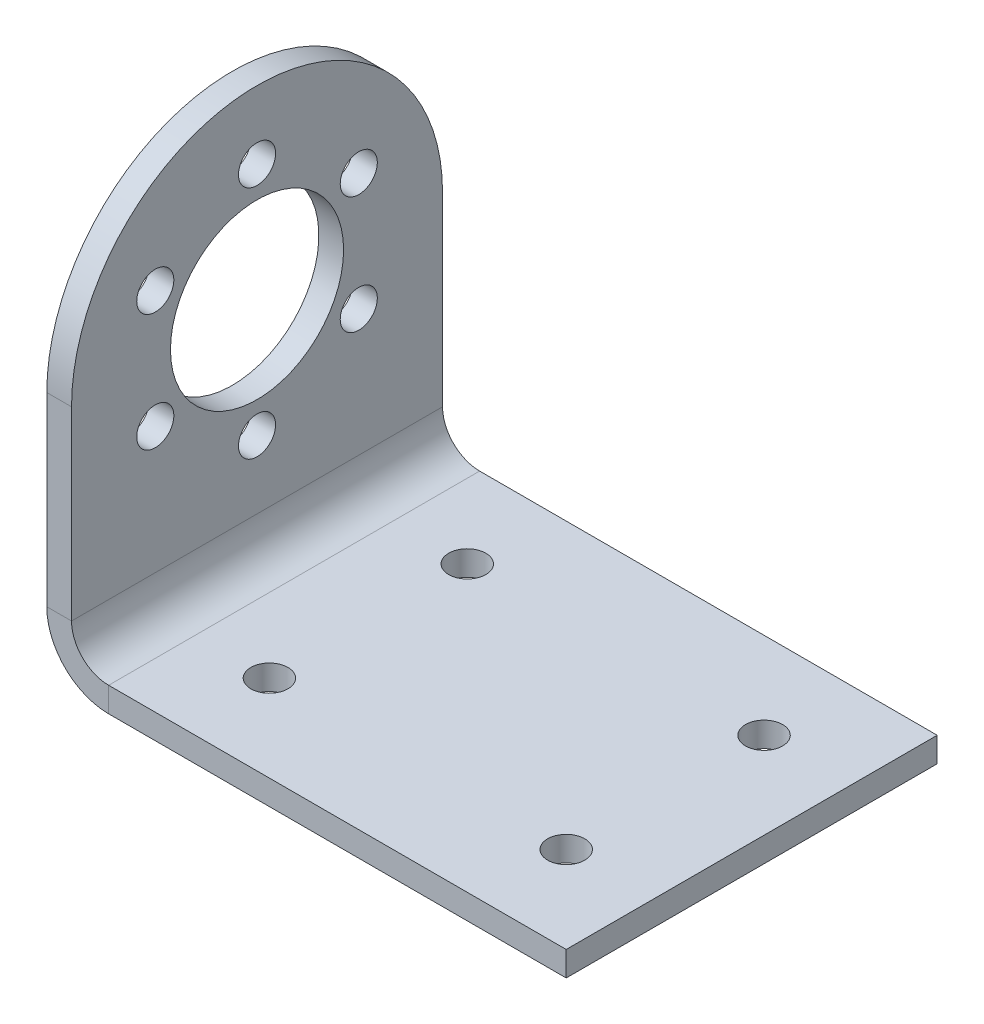
ISO-10303-21;
HEADER;
FILE_DESCRIPTION(('STEP AP214'),'2;1');
FILE_NAME('part.step','',(''),(''),'','','');
FILE_SCHEMA(('AUTOMOTIVE_DESIGN { 1 0 10303 214 1 1 1 1 }'));
ENDSEC;
DATA;
#1=APPLICATION_CONTEXT('core data for automotive mechanical design processes');
#2=APPLICATION_PROTOCOL_DEFINITION('international standard','automotive_design',2000,#1);
#3=PRODUCT_CONTEXT('',#1,'mechanical');
#4=PRODUCT('Part','Part','',(#3));
#5=PRODUCT_RELATED_PRODUCT_CATEGORY('part','',(#4));
#6=PRODUCT_DEFINITION_FORMATION('','',#4);
#7=PRODUCT_DEFINITION_CONTEXT('part definition',#1,'design');
#8=PRODUCT_DEFINITION('design','',#6,#7);
#9=PRODUCT_DEFINITION_SHAPE('','',#8);
#10=(LENGTH_UNIT() NAMED_UNIT(*) SI_UNIT(.MILLI.,.METRE.));
#11=(NAMED_UNIT(*) PLANE_ANGLE_UNIT() SI_UNIT($,.RADIAN.));
#12=(NAMED_UNIT(*) SI_UNIT($,.STERADIAN.) SOLID_ANGLE_UNIT());
#13=UNCERTAINTY_MEASURE_WITH_UNIT(LENGTH_MEASURE(1.E-05),#10,'distance_accuracy_value','');
#14=(GEOMETRIC_REPRESENTATION_CONTEXT(3) GLOBAL_UNCERTAINTY_ASSIGNED_CONTEXT((#13)) GLOBAL_UNIT_ASSIGNED_CONTEXT((#10,
#11,#12)) REPRESENTATION_CONTEXT('',''));
#15=CARTESIAN_POINT('',(0.,0.,0.));
#16=DIRECTION('',(0.,0.,1.));
#17=DIRECTION('',(1.,0.,0.));
#18=AXIS2_PLACEMENT_3D('',#15,#16,#17);
#19=CARTESIAN_POINT('',(-47.0242214532872,21.7370242214533,30.));
#20=DIRECTION('',(1.,0.,0.));
#21=DIRECTION('',(0.,0.,-1.));
#22=AXIS2_PLACEMENT_3D('',#19,#20,#21);
#23=PLANE('',#22);
#24=CARTESIAN_POINT('',(-47.0242214532872,11.4870242214533,6.7727586640477));
#25=DIRECTION('',(1.,0.,0.));
#26=DIRECTION('',(0.,0.,-1.));
#27=AXIS2_PLACEMENT_3D('',#24,#25,#26);
#28=CIRCLE('',#27,1.5);
#29=CARTESIAN_POINT('',(-47.0242214532872,11.4870242214533,5.27275866404769));
#30=VERTEX_POINT('',#29);
#31=EDGE_CURVE('E249',#30,#30,#28,.T.);
#32=ORIENTED_EDGE('',*,*,#31,.F.);
#33=EDGE_LOOP('',(#32));
#34=FACE_BOUND('',#33,.T.);
#35=CARTESIAN_POINT('',(-47.0242214532872,1.98702422145352,6.7727586640477));
#36=DIRECTION('',(1.,0.,0.));
#37=DIRECTION('',(0.,0.,-1.));
#38=AXIS2_PLACEMENT_3D('',#35,#36,#37);
#39=CIRCLE('',#38,1.5);
#40=CARTESIAN_POINT('',(-47.0242214532872,1.98702422145352,5.2727586640477));
#41=VERTEX_POINT('',#40);
#42=EDGE_CURVE('E347',#41,#41,#39,.T.);
#43=ORIENTED_EDGE('',*,*,#42,.F.);
#44=EDGE_LOOP('',(#43));
#45=FACE_BOUND('',#44,.T.);
#46=CARTESIAN_POINT('',(-47.0242214532872,-2.76297577854671,15.));
#47=DIRECTION('',(1.,0.,0.));
#48=DIRECTION('',(0.,0.,-1.));
#49=AXIS2_PLACEMENT_3D('',#46,#47,#48);
#50=CIRCLE('',#49,1.5);
#51=CARTESIAN_POINT('',(-47.0242214532872,-2.76297577854671,13.5));
#52=VERTEX_POINT('',#51);
#53=EDGE_CURVE('E350',#52,#52,#50,.T.);
#54=ORIENTED_EDGE('',*,*,#53,.F.);
#55=EDGE_LOOP('',(#54));
#56=FACE_BOUND('',#55,.T.);
#57=CARTESIAN_POINT('',(-47.0242214532872,1.98702422145327,23.2272413359522));
#58=DIRECTION('',(1.,0.,0.));
#59=DIRECTION('',(0.,0.,-1.));
#60=AXIS2_PLACEMENT_3D('',#57,#58,#59);
#61=CIRCLE('',#60,1.5);
#62=CARTESIAN_POINT('',(-47.0242214532872,1.98702422145327,21.7272413359522));
#63=VERTEX_POINT('',#62);
#64=EDGE_CURVE('E353',#63,#63,#61,.T.);
#65=ORIENTED_EDGE('',*,*,#64,.F.);
#66=EDGE_LOOP('',(#65));
#67=FACE_BOUND('',#66,.T.);
#68=CARTESIAN_POINT('',(-47.0242214532872,16.2370242214533,15.));
#69=DIRECTION('',(1.,0.,0.));
#70=DIRECTION('',(0.,0.,-1.));
#71=AXIS2_PLACEMENT_3D('',#68,#69,#70);
#72=CIRCLE('',#71,1.5);
#73=CARTESIAN_POINT('',(-47.0242214532872,16.2370242214533,13.5));
#74=VERTEX_POINT('',#73);
#75=EDGE_CURVE('E356',#74,#74,#72,.T.);
#76=ORIENTED_EDGE('',*,*,#75,.F.);
#77=EDGE_LOOP('',(#76));
#78=FACE_BOUND('',#77,.T.);
#79=CARTESIAN_POINT('',(-47.0242214532872,11.4870242214533,23.2272413359522));
#80=DIRECTION('',(1.,0.,0.));
#81=DIRECTION('',(0.,0.,-1.));
#82=AXIS2_PLACEMENT_3D('',#79,#80,#81);
#83=CIRCLE('',#82,1.5);
#84=CARTESIAN_POINT('',(-47.0242214532872,11.4870242214533,21.7272413359522));
#85=VERTEX_POINT('',#84);
#86=EDGE_CURVE('E359',#85,#85,#83,.T.);
#87=ORIENTED_EDGE('',*,*,#86,.F.);
#88=EDGE_LOOP('',(#87));
#89=FACE_BOUND('',#88,.T.);
#90=CARTESIAN_POINT('',(-47.0242214532872,6.73702422145329,15.));
#91=DIRECTION('',(1.,0.,0.));
#92=DIRECTION('',(0.,0.,-1.));
#93=AXIS2_PLACEMENT_3D('',#90,#91,#92);
#94=CIRCLE('',#93,7.);
#95=CARTESIAN_POINT('',(-47.0242214532872,6.73702422145329,8.));
#96=VERTEX_POINT('',#95);
#97=EDGE_CURVE('E362',#96,#96,#94,.T.);
#98=ORIENTED_EDGE('',*,*,#97,.F.);
#99=EDGE_LOOP('',(#98));
#100=FACE_BOUND('',#99,.T.);
#101=DIRECTION('',(0.,-1.,0.));
#102=VECTOR('',#101,1.);
#103=CARTESIAN_POINT('',(-47.0242214532872,21.7370242214533,0.));
#104=LINE('',#103,#102);
#105=CARTESIAN_POINT('',(-47.0242214532872,6.73702422145329,0.));
#106=VERTEX_POINT('',#105);
#107=CARTESIAN_POINT('',(-47.0242214532872,-8.26297577854672,0.));
#108=VERTEX_POINT('',#107);
#109=EDGE_CURVE('E256',#106,#108,#104,.T.);
#110=ORIENTED_EDGE('',*,*,#109,.F.);
#111=CARTESIAN_POINT('',(-47.0242214532872,6.73702422145329,15.));
#112=DIRECTION('',(1.,0.,0.));
#113=DIRECTION('',(0.,0.,-1.));
#114=AXIS2_PLACEMENT_3D('',#111,#112,#113);
#115=CIRCLE('',#114,15.);
#116=CARTESIAN_POINT('',(-47.0242214532872,6.73702422145329,30.));
#117=VERTEX_POINT('',#116);
#118=EDGE_CURVE('E211',#106,#117,#115,.T.);
#119=ORIENTED_EDGE('',*,*,#118,.T.);
#120=DIRECTION('',(0.,-1.,0.));
#121=VECTOR('',#120,1.);
#122=CARTESIAN_POINT('',(-47.0242214532872,21.7370242214533,30.));
#123=LINE('',#122,#121);
#124=CARTESIAN_POINT('',(-47.0242214532872,-8.26297577854672,30.));
#125=VERTEX_POINT('',#124);
#126=EDGE_CURVE('E204',#117,#125,#123,.T.);
#127=ORIENTED_EDGE('',*,*,#126,.T.);
#128=DIRECTION('',(0.,0.,-1.));
#129=VECTOR('',#128,1.);
#130=CARTESIAN_POINT('',(-47.0242214532872,-8.26297577854672,30.));
#131=LINE('',#130,#129);
#132=EDGE_CURVE('E208',#125,#108,#131,.T.);
#133=ORIENTED_EDGE('',*,*,#132,.T.);
#134=EDGE_LOOP('',(#110,#119,#127,#133));
#135=FACE_BOUND('',#134,.T.);
#136=ADVANCED_FACE('F135',(#34,#45,#56,#67,#78,#89,#100,#135),#23,.T.);
#137=CARTESIAN_POINT('',(-49.0242214532872,21.7370242214533,30.));
#138=DIRECTION('',(1.,0.,0.));
#139=DIRECTION('',(0.,0.,-1.));
#140=AXIS2_PLACEMENT_3D('',#137,#138,#139);
#141=PLANE('',#140);
#142=CARTESIAN_POINT('',(-49.0242214532872,16.2370242214533,15.));
#143=DIRECTION('',(-1.,0.,0.));
#144=DIRECTION('',(0.,0.,1.));
#145=AXIS2_PLACEMENT_3D('',#142,#143,#144);
#146=CIRCLE('',#145,1.5);
#147=CARTESIAN_POINT('',(-49.0242214532872,16.2370242214533,16.5));
#148=VERTEX_POINT('',#147);
#149=EDGE_CURVE('E382',#148,#148,#146,.T.);
#150=ORIENTED_EDGE('',*,*,#149,.F.);
#151=EDGE_LOOP('',(#150));
#152=FACE_BOUND('',#151,.T.);
#153=CARTESIAN_POINT('',(-49.0242214532872,11.4870242214533,23.2272413359522));
#154=DIRECTION('',(-1.,0.,0.));
#155=DIRECTION('',(0.,0.,1.));
#156=AXIS2_PLACEMENT_3D('',#153,#154,#155);
#157=CIRCLE('',#156,1.5);
#158=CARTESIAN_POINT('',(-49.0242214532872,11.4870242214533,24.7272413359522));
#159=VERTEX_POINT('',#158);
#160=EDGE_CURVE('E374',#159,#159,#157,.T.);
#161=ORIENTED_EDGE('',*,*,#160,.F.);
#162=EDGE_LOOP('',(#161));
#163=FACE_BOUND('',#162,.T.);
#164=CARTESIAN_POINT('',(-49.0242214532872,6.73702422145329,15.));
#165=DIRECTION('',(-1.,0.,0.));
#166=DIRECTION('',(0.,0.,1.));
#167=AXIS2_PLACEMENT_3D('',#164,#165,#166);
#168=CIRCLE('',#167,7.);
#169=CARTESIAN_POINT('',(-49.0242214532872,6.73702422145329,22.));
#170=VERTEX_POINT('',#169);
#171=EDGE_CURVE('E366',#170,#170,#168,.T.);
#172=ORIENTED_EDGE('',*,*,#171,.F.);
#173=EDGE_LOOP('',(#172));
#174=FACE_BOUND('',#173,.T.);
#175=CARTESIAN_POINT('',(-49.0242214532872,1.98702422145327,23.2272413359522));
#176=DIRECTION('',(-1.,0.,0.));
#177=DIRECTION('',(0.,0.,1.));
#178=AXIS2_PLACEMENT_3D('',#175,#176,#177);
#179=CIRCLE('',#178,1.5);
#180=CARTESIAN_POINT('',(-49.0242214532872,1.98702422145327,24.7272413359522));
#181=VERTEX_POINT('',#180);
#182=EDGE_CURVE('E370',#181,#181,#179,.T.);
#183=ORIENTED_EDGE('',*,*,#182,.F.);
#184=EDGE_LOOP('',(#183));
#185=FACE_BOUND('',#184,.T.);
#186=CARTESIAN_POINT('',(-49.0242214532872,-2.76297577854671,15.));
#187=DIRECTION('',(-1.,0.,0.));
#188=DIRECTION('',(0.,0.,1.));
#189=AXIS2_PLACEMENT_3D('',#186,#187,#188);
#190=CIRCLE('',#189,1.5);
#191=CARTESIAN_POINT('',(-49.0242214532872,-2.76297577854671,16.5));
#192=VERTEX_POINT('',#191);
#193=EDGE_CURVE('E373',#192,#192,#190,.T.);
#194=ORIENTED_EDGE('',*,*,#193,.F.);
#195=EDGE_LOOP('',(#194));
#196=FACE_BOUND('',#195,.T.);
#197=CARTESIAN_POINT('',(-49.0242214532872,1.98702422145352,6.7727586640477));
#198=DIRECTION('',(-1.,0.,0.));
#199=DIRECTION('',(0.,0.,1.));
#200=AXIS2_PLACEMENT_3D('',#197,#198,#199);
#201=CIRCLE('',#200,1.5);
#202=CARTESIAN_POINT('',(-49.0242214532872,1.98702422145352,8.2727586640477));
#203=VERTEX_POINT('',#202);
#204=EDGE_CURVE('E377',#203,#203,#201,.T.);
#205=ORIENTED_EDGE('',*,*,#204,.F.);
#206=EDGE_LOOP('',(#205));
#207=FACE_BOUND('',#206,.T.);
#208=CARTESIAN_POINT('',(-49.0242214532872,11.4870242214533,6.7727586640477));
#209=DIRECTION('',(-1.,0.,0.));
#210=DIRECTION('',(0.,0.,1.));
#211=AXIS2_PLACEMENT_3D('',#208,#209,#210);
#212=CIRCLE('',#211,1.5);
#213=CARTESIAN_POINT('',(-49.0242214532872,11.4870242214533,8.2727586640477));
#214=VERTEX_POINT('',#213);
#215=EDGE_CURVE('E369',#214,#214,#212,.T.);
#216=ORIENTED_EDGE('',*,*,#215,.F.);
#217=EDGE_LOOP('',(#216));
#218=FACE_BOUND('',#217,.T.);
#219=CARTESIAN_POINT('',(-49.0242214532872,6.73702422145329,15.));
#220=DIRECTION('',(-1.,0.,0.));
#221=DIRECTION('',(0.,0.,1.));
#222=AXIS2_PLACEMENT_3D('',#219,#220,#221);
#223=CIRCLE('',#222,15.);
#224=CARTESIAN_POINT('',(-49.0242214532872,6.73702422145329,30.));
#225=VERTEX_POINT('',#224);
#226=CARTESIAN_POINT('',(-49.0242214532872,6.73702422145329,0.));
#227=VERTEX_POINT('',#226);
#228=EDGE_CURVE('E150',#225,#227,#223,.T.);
#229=ORIENTED_EDGE('',*,*,#228,.T.);
#230=DIRECTION('',(0.,1.,0.));
#231=VECTOR('',#230,1.);
#232=CARTESIAN_POINT('',(-49.0242214532872,21.7370242214533,0.));
#233=LINE('',#232,#231);
#234=CARTESIAN_POINT('',(-49.0242214532872,-8.26297577854672,0.));
#235=VERTEX_POINT('',#234);
#236=EDGE_CURVE('E258',#227,#235,#233,.F.);
#237=ORIENTED_EDGE('',*,*,#236,.T.);
#238=DIRECTION('',(0.,0.,-1.));
#239=VECTOR('',#238,1.);
#240=CARTESIAN_POINT('',(-49.0242214532872,-8.26297577854672,30.));
#241=LINE('',#240,#239);
#242=CARTESIAN_POINT('',(-49.0242214532872,-8.26297577854672,30.));
#243=VERTEX_POINT('',#242);
#244=EDGE_CURVE('E231',#243,#235,#241,.T.);
#245=ORIENTED_EDGE('',*,*,#244,.F.);
#246=DIRECTION('',(0.,1.,0.));
#247=VECTOR('',#246,1.);
#248=CARTESIAN_POINT('',(-49.0242214532872,21.7370242214533,30.));
#249=LINE('',#248,#247);
#250=EDGE_CURVE('E213',#225,#243,#249,.F.);
#251=ORIENTED_EDGE('',*,*,#250,.F.);
#252=EDGE_LOOP('',(#229,#237,#245,#251));
#253=FACE_BOUND('',#252,.T.);
#254=ADVANCED_FACE('F295',(#152,#163,#174,#185,#196,#207,#218,#253),#141,.F.);
#255=CARTESIAN_POINT('',(-44.0242214532872,-11.2629757785467,30.));
#256=DIRECTION('',(0.,0.,1.));
#257=DIRECTION('',(1.,0.,0.));
#258=AXIS2_PLACEMENT_3D('',#255,#256,#257);
#259=PLANE('',#258);
#260=DIRECTION('',(0.,-1.,0.));
#261=VECTOR('',#260,1.);
#262=CARTESIAN_POINT('',(-44.0242214532872,-11.2629757785467,30.));
#263=LINE('',#262,#261);
#264=CARTESIAN_POINT('',(-44.0242214532872,-11.2629757785467,30.));
#265=VERTEX_POINT('',#264);
#266=CARTESIAN_POINT('',(-44.0242214532872,-13.2629757785467,30.));
#267=VERTEX_POINT('',#266);
#268=EDGE_CURVE('E143',#265,#267,#263,.T.);
#269=ORIENTED_EDGE('',*,*,#268,.F.);
#270=CARTESIAN_POINT('',(-44.0242214532872,-8.26297577854672,30.));
#271=DIRECTION('',(0.,0.,-1.));
#272=DIRECTION('',(-1.,0.,0.));
#273=AXIS2_PLACEMENT_3D('',#270,#271,#272);
#274=CIRCLE('',#273,3.);
#275=EDGE_CURVE('E214',#125,#265,#274,.F.);
#276=ORIENTED_EDGE('',*,*,#275,.F.);
#277=DIRECTION('',(1.,0.,0.));
#278=VECTOR('',#277,1.);
#279=CARTESIAN_POINT('',(-49.0242214532872,-8.26297577854672,30.));
#280=LINE('',#279,#278);
#281=EDGE_CURVE('E217',#243,#125,#280,.T.);
#282=ORIENTED_EDGE('',*,*,#281,.F.);
#283=CARTESIAN_POINT('',(-44.0242214532872,-8.26297577854672,30.));
#284=DIRECTION('',(0.,0.,1.));
#285=DIRECTION('',(1.,0.,0.));
#286=AXIS2_PLACEMENT_3D('',#283,#284,#285);
#287=CIRCLE('',#286,5.);
#288=EDGE_CURVE('E242',#243,#267,#287,.T.);
#289=ORIENTED_EDGE('',*,*,#288,.T.);
#290=EDGE_LOOP('',(#269,#276,#282,#289));
#291=FACE_BOUND('',#290,.T.);
#292=ADVANCED_FACE('F137',(#291),#259,.T.);
#293=CARTESIAN_POINT('',(-49.0242214532872,-8.26297577854672,30.));
#294=DIRECTION('',(0.,0.,1.));
#295=DIRECTION('',(1.,0.,0.));
#296=AXIS2_PLACEMENT_3D('',#293,#294,#295);
#297=PLANE('',#296);
#298=DIRECTION('',(1.,0.,0.));
#299=VECTOR('',#298,1.);
#300=CARTESIAN_POINT('',(-47.0242214532872,-11.2629757785467,30.));
#301=LINE('',#300,#299);
#302=CARTESIAN_POINT('',(-7.02422145328719,-11.2629757785467,30.));
#303=VERTEX_POINT('',#302);
#304=EDGE_CURVE('E234',#265,#303,#301,.T.);
#305=ORIENTED_EDGE('',*,*,#304,.F.);
#306=ORIENTED_EDGE('',*,*,#268,.T.);
#307=DIRECTION('',(1.,0.,0.));
#308=VECTOR('',#307,1.);
#309=CARTESIAN_POINT('',(-47.0242214532872,-13.2629757785467,30.));
#310=LINE('',#309,#308);
#311=CARTESIAN_POINT('',(-7.02422145328719,-13.2629757785467,30.));
#312=VERTEX_POINT('',#311);
#313=EDGE_CURVE('E191',#267,#312,#310,.T.);
#314=ORIENTED_EDGE('',*,*,#313,.T.);
#315=DIRECTION('',(0.,-1.,0.));
#316=VECTOR('',#315,1.);
#317=CARTESIAN_POINT('',(-7.02422145328719,-11.2629757785467,30.));
#318=LINE('',#317,#316);
#319=EDGE_CURVE('E237',#303,#312,#318,.T.);
#320=ORIENTED_EDGE('',*,*,#319,.F.);
#321=EDGE_LOOP('',(#305,#306,#314,#320));
#322=FACE_BOUND('',#321,.T.);
#323=ADVANCED_FACE('F286',(#322),#297,.T.);
#324=CARTESIAN_POINT('',(-47.0242214532872,-8.26297577854672,0.));
#325=DIRECTION('',(0.,0.,-1.));
#326=DIRECTION('',(-1.,0.,0.));
#327=AXIS2_PLACEMENT_3D('',#324,#325,#326);
#328=PLANE('',#327);
#329=DIRECTION('',(-1.,0.,0.));
#330=VECTOR('',#329,1.);
#331=CARTESIAN_POINT('',(-47.0242214532872,-8.26297577854672,0.));
#332=LINE('',#331,#330);
#333=EDGE_CURVE('E223',#108,#235,#332,.T.);
#334=ORIENTED_EDGE('',*,*,#333,.F.);
#335=CARTESIAN_POINT('',(-44.0242214532872,-8.26297577854672,0.));
#336=DIRECTION('',(0.,0.,-1.));
#337=DIRECTION('',(-1.,0.,0.));
#338=AXIS2_PLACEMENT_3D('',#335,#336,#337);
#339=CIRCLE('',#338,3.);
#340=CARTESIAN_POINT('',(-44.0242214532872,-11.2629757785467,0.));
#341=VERTEX_POINT('',#340);
#342=EDGE_CURVE('E229',#108,#341,#339,.F.);
#343=ORIENTED_EDGE('',*,*,#342,.T.);
#344=DIRECTION('',(0.,1.,0.));
#345=VECTOR('',#344,1.);
#346=CARTESIAN_POINT('',(-44.0242214532872,-13.2629757785467,0.));
#347=LINE('',#346,#345);
#348=CARTESIAN_POINT('',(-44.0242214532872,-13.2629757785467,0.));
#349=VERTEX_POINT('',#348);
#350=EDGE_CURVE('E185',#349,#341,#347,.T.);
#351=ORIENTED_EDGE('',*,*,#350,.F.);
#352=CARTESIAN_POINT('',(-44.0242214532872,-8.26297577854672,0.));
#353=DIRECTION('',(0.,0.,1.));
#354=DIRECTION('',(1.,0.,0.));
#355=AXIS2_PLACEMENT_3D('',#352,#353,#354);
#356=CIRCLE('',#355,5.);
#357=EDGE_CURVE('E260',#235,#349,#356,.T.);
#358=ORIENTED_EDGE('',*,*,#357,.F.);
#359=EDGE_LOOP('',(#334,#343,#351,#358));
#360=FACE_BOUND('',#359,.T.);
#361=ADVANCED_FACE('F284',(#360),#328,.T.);
#362=CARTESIAN_POINT('',(-44.0242214532872,-13.2629757785467,0.));
#363=DIRECTION('',(0.,0.,-1.));
#364=DIRECTION('',(-1.,0.,0.));
#365=AXIS2_PLACEMENT_3D('',#362,#363,#364);
#366=PLANE('',#365);
#367=DIRECTION('',(-1.,0.,0.));
#368=VECTOR('',#367,1.);
#369=CARTESIAN_POINT('',(-39.0242214532872,6.73702422145329,0.));
#370=LINE('',#369,#368);
#371=EDGE_CURVE('E388',#106,#227,#370,.T.);
#372=ORIENTED_EDGE('',*,*,#371,.F.);
#373=ORIENTED_EDGE('',*,*,#109,.T.);
#374=ORIENTED_EDGE('',*,*,#333,.T.);
#375=ORIENTED_EDGE('',*,*,#236,.F.);
#376=EDGE_LOOP('',(#372,#373,#374,#375));
#377=FACE_BOUND('',#376,.T.);
#378=ADVANCED_FACE('F277',(#377),#366,.T.);
#379=CARTESIAN_POINT('',(-47.0242214532872,-13.2629757785467,30.));
#380=DIRECTION('',(0.,1.,0.));
#381=DIRECTION('',(0.,0.,1.));
#382=AXIS2_PLACEMENT_3D('',#379,#380,#381);
#383=PLANE('',#382);
#384=CARTESIAN_POINT('',(-38.0242214532872,-13.2629757785467,7.));
#385=DIRECTION('',(0.,1.,0.));
#386=DIRECTION('',(0.,0.,1.));
#387=AXIS2_PLACEMENT_3D('',#384,#385,#386);
#388=CIRCLE('',#387,1.5);
#389=CARTESIAN_POINT('',(-38.0242214532872,-13.2629757785467,8.5));
#390=VERTEX_POINT('',#389);
#391=EDGE_CURVE('E324',#390,#390,#388,.T.);
#392=ORIENTED_EDGE('',*,*,#391,.T.);
#393=EDGE_LOOP('',(#392));
#394=FACE_BOUND('',#393,.T.);
#395=CARTESIAN_POINT('',(-14.0242214532872,-13.2629757785467,23.));
#396=DIRECTION('',(0.,1.,0.));
#397=DIRECTION('',(0.,0.,1.));
#398=AXIS2_PLACEMENT_3D('',#395,#396,#397);
#399=CIRCLE('',#398,1.5);
#400=CARTESIAN_POINT('',(-14.0242214532872,-13.2629757785467,24.5));
#401=VERTEX_POINT('',#400);
#402=EDGE_CURVE('E328',#401,#401,#399,.T.);
#403=ORIENTED_EDGE('',*,*,#402,.T.);
#404=EDGE_LOOP('',(#403));
#405=FACE_BOUND('',#404,.T.);
#406=CARTESIAN_POINT('',(-14.0242214532872,-13.2629757785467,7.));
#407=DIRECTION('',(0.,1.,0.));
#408=DIRECTION('',(0.,0.,1.));
#409=AXIS2_PLACEMENT_3D('',#406,#407,#408);
#410=CIRCLE('',#409,1.5);
#411=CARTESIAN_POINT('',(-14.0242214532872,-13.2629757785467,8.5));
#412=VERTEX_POINT('',#411);
#413=EDGE_CURVE('E332',#412,#412,#410,.T.);
#414=ORIENTED_EDGE('',*,*,#413,.T.);
#415=EDGE_LOOP('',(#414));
#416=FACE_BOUND('',#415,.T.);
#417=CARTESIAN_POINT('',(-38.0242214532872,-13.2629757785467,23.));
#418=DIRECTION('',(0.,1.,0.));
#419=DIRECTION('',(0.,0.,1.));
#420=AXIS2_PLACEMENT_3D('',#417,#418,#419);
#421=CIRCLE('',#420,1.5);
#422=CARTESIAN_POINT('',(-38.0242214532872,-13.2629757785467,24.5));
#423=VERTEX_POINT('',#422);
#424=EDGE_CURVE('E336',#423,#423,#421,.T.);
#425=ORIENTED_EDGE('',*,*,#424,.T.);
#426=EDGE_LOOP('',(#425));
#427=FACE_BOUND('',#426,.T.);
#428=DIRECTION('',(1.,0.,0.));
#429=VECTOR('',#428,1.);
#430=CARTESIAN_POINT('',(-47.0242214532872,-13.2629757785467,0.));
#431=LINE('',#430,#429);
#432=CARTESIAN_POINT('',(-7.02422145328719,-13.2629757785467,0.));
#433=VERTEX_POINT('',#432);
#434=EDGE_CURVE('E245',#349,#433,#431,.T.);
#435=ORIENTED_EDGE('',*,*,#434,.T.);
#436=DIRECTION('',(0.,0.,-1.));
#437=VECTOR('',#436,1.);
#438=CARTESIAN_POINT('',(-7.02422145328719,-13.2629757785467,30.));
#439=LINE('',#438,#437);
#440=EDGE_CURVE('E269',#312,#433,#439,.T.);
#441=ORIENTED_EDGE('',*,*,#440,.F.);
#442=ORIENTED_EDGE('',*,*,#313,.F.);
#443=DIRECTION('',(0.,0.,-1.));
#444=VECTOR('',#443,1.);
#445=CARTESIAN_POINT('',(-44.0242214532872,-13.2629757785467,30.));
#446=LINE('',#445,#444);
#447=EDGE_CURVE('E244',#267,#349,#446,.T.);
#448=ORIENTED_EDGE('',*,*,#447,.T.);
#449=EDGE_LOOP('',(#435,#441,#442,#448));
#450=FACE_BOUND('',#449,.T.);
#451=ADVANCED_FACE('F292',(#394,#405,#416,#427,#450),#383,.F.);
#452=CARTESIAN_POINT('',(-7.02422145328719,-11.2629757785467,30.));
#453=DIRECTION('',(1.,0.,0.));
#454=DIRECTION('',(0.,0.,-1.));
#455=AXIS2_PLACEMENT_3D('',#452,#453,#454);
#456=PLANE('',#455);
#457=DIRECTION('',(0.,-1.,0.));
#458=VECTOR('',#457,1.);
#459=CARTESIAN_POINT('',(-7.02422145328719,-11.2629757785467,0.));
#460=LINE('',#459,#458);
#461=CARTESIAN_POINT('',(-7.02422145328719,-11.2629757785467,0.));
#462=VERTEX_POINT('',#461);
#463=EDGE_CURVE('E248',#462,#433,#460,.T.);
#464=ORIENTED_EDGE('',*,*,#463,.F.);
#465=DIRECTION('',(0.,0.,-1.));
#466=VECTOR('',#465,1.);
#467=CARTESIAN_POINT('',(-7.02422145328719,-11.2629757785467,30.));
#468=LINE('',#467,#466);
#469=EDGE_CURVE('E267',#303,#462,#468,.T.);
#470=ORIENTED_EDGE('',*,*,#469,.F.);
#471=ORIENTED_EDGE('',*,*,#319,.T.);
#472=ORIENTED_EDGE('',*,*,#440,.T.);
#473=EDGE_LOOP('',(#464,#470,#471,#472));
#474=FACE_BOUND('',#473,.T.);
#475=ADVANCED_FACE('F312',(#474),#456,.T.);
#476=CARTESIAN_POINT('',(-47.0242214532872,-11.2629757785467,30.));
#477=DIRECTION('',(0.,1.,0.));
#478=DIRECTION('',(0.,0.,1.));
#479=AXIS2_PLACEMENT_3D('',#476,#477,#478);
#480=PLANE('',#479);
#481=CARTESIAN_POINT('',(-38.0242214532872,-11.2629757785467,7.));
#482=DIRECTION('',(0.,1.,0.));
#483=DIRECTION('',(0.,0.,1.));
#484=AXIS2_PLACEMENT_3D('',#481,#482,#483);
#485=CIRCLE('',#484,1.5);
#486=CARTESIAN_POINT('',(-38.0242214532872,-11.2629757785467,8.5));
#487=VERTEX_POINT('',#486);
#488=EDGE_CURVE('E397',#487,#487,#485,.T.);
#489=ORIENTED_EDGE('',*,*,#488,.F.);
#490=EDGE_LOOP('',(#489));
#491=FACE_BOUND('',#490,.T.);
#492=CARTESIAN_POINT('',(-14.0242214532872,-11.2629757785467,23.));
#493=DIRECTION('',(0.,1.,0.));
#494=DIRECTION('',(0.,0.,1.));
#495=AXIS2_PLACEMENT_3D('',#492,#493,#494);
#496=CIRCLE('',#495,1.5);
#497=CARTESIAN_POINT('',(-14.0242214532872,-11.2629757785467,24.5));
#498=VERTEX_POINT('',#497);
#499=EDGE_CURVE('E398',#498,#498,#496,.T.);
#500=ORIENTED_EDGE('',*,*,#499,.F.);
#501=EDGE_LOOP('',(#500));
#502=FACE_BOUND('',#501,.T.);
#503=CARTESIAN_POINT('',(-14.0242214532872,-11.2629757785467,7.));
#504=DIRECTION('',(0.,1.,0.));
#505=DIRECTION('',(0.,0.,1.));
#506=AXIS2_PLACEMENT_3D('',#503,#504,#505);
#507=CIRCLE('',#506,1.5);
#508=CARTESIAN_POINT('',(-14.0242214532872,-11.2629757785467,8.5));
#509=VERTEX_POINT('',#508);
#510=EDGE_CURVE('E401',#509,#509,#507,.T.);
#511=ORIENTED_EDGE('',*,*,#510,.F.);
#512=EDGE_LOOP('',(#511));
#513=FACE_BOUND('',#512,.T.);
#514=CARTESIAN_POINT('',(-38.0242214532872,-11.2629757785467,23.));
#515=DIRECTION('',(0.,1.,0.));
#516=DIRECTION('',(0.,0.,1.));
#517=AXIS2_PLACEMENT_3D('',#514,#515,#516);
#518=CIRCLE('',#517,1.5);
#519=CARTESIAN_POINT('',(-38.0242214532872,-11.2629757785467,24.5));
#520=VERTEX_POINT('',#519);
#521=EDGE_CURVE('E394',#520,#520,#518,.T.);
#522=ORIENTED_EDGE('',*,*,#521,.F.);
#523=EDGE_LOOP('',(#522));
#524=FACE_BOUND('',#523,.T.);
#525=DIRECTION('',(1.,0.,0.));
#526=VECTOR('',#525,1.);
#527=CARTESIAN_POINT('',(-47.0242214532872,-11.2629757785467,0.));
#528=LINE('',#527,#526);
#529=EDGE_CURVE('E252',#341,#462,#528,.T.);
#530=ORIENTED_EDGE('',*,*,#529,.F.);
#531=DIRECTION('',(0.,0.,-1.));
#532=VECTOR('',#531,1.);
#533=CARTESIAN_POINT('',(-44.0242214532872,-11.2629757785467,30.));
#534=LINE('',#533,#532);
#535=EDGE_CURVE('E230',#265,#341,#534,.T.);
#536=ORIENTED_EDGE('',*,*,#535,.F.);
#537=ORIENTED_EDGE('',*,*,#304,.T.);
#538=ORIENTED_EDGE('',*,*,#469,.T.);
#539=EDGE_LOOP('',(#530,#536,#537,#538));
#540=FACE_BOUND('',#539,.T.);
#541=ADVANCED_FACE('F309',(#491,#502,#513,#524,#540),#480,.T.);
#542=CARTESIAN_POINT('',(-44.0242214532872,-8.26297577854672,30.));
#543=DIRECTION('',(0.,0.,-1.));
#544=DIRECTION('',(-1.,0.,0.));
#545=AXIS2_PLACEMENT_3D('',#542,#543,#544);
#546=CYLINDRICAL_SURFACE('',#545,3.);
#547=ORIENTED_EDGE('',*,*,#342,.F.);
#548=ORIENTED_EDGE('',*,*,#132,.F.);
#549=ORIENTED_EDGE('',*,*,#275,.T.);
#550=ORIENTED_EDGE('',*,*,#535,.T.);
#551=EDGE_LOOP('',(#547,#548,#549,#550));
#552=FACE_BOUND('',#551,.T.);
#553=ADVANCED_FACE('F227',(#552),#546,.F.);
#554=CARTESIAN_POINT('',(-44.0242214532872,-8.26297577854672,30.));
#555=DIRECTION('',(0.,0.,-1.));
#556=DIRECTION('',(-1.,0.,0.));
#557=AXIS2_PLACEMENT_3D('',#554,#555,#556);
#558=CYLINDRICAL_SURFACE('',#557,5.);
#559=ORIENTED_EDGE('',*,*,#357,.T.);
#560=ORIENTED_EDGE('',*,*,#447,.F.);
#561=ORIENTED_EDGE('',*,*,#288,.F.);
#562=ORIENTED_EDGE('',*,*,#244,.T.);
#563=EDGE_LOOP('',(#559,#560,#561,#562));
#564=FACE_BOUND('',#563,.T.);
#565=ADVANCED_FACE('F281',(#564),#558,.T.);
#566=CARTESIAN_POINT('',(-44.0242214532872,-8.26297577854672,30.));
#567=DIRECTION('',(0.,0.,-1.));
#568=DIRECTION('',(-1.,0.,0.));
#569=AXIS2_PLACEMENT_3D('',#566,#567,#568);
#570=PLANE('',#569);
#571=ORIENTED_EDGE('',*,*,#126,.F.);
#572=DIRECTION('',(-1.,0.,0.));
#573=VECTOR('',#572,1.);
#574=CARTESIAN_POINT('',(-39.0242214532872,6.73702422145329,30.));
#575=LINE('',#574,#573);
#576=EDGE_CURVE('E12',#117,#225,#575,.T.);
#577=ORIENTED_EDGE('',*,*,#576,.T.);
#578=ORIENTED_EDGE('',*,*,#250,.T.);
#579=ORIENTED_EDGE('',*,*,#281,.T.);
#580=EDGE_LOOP('',(#571,#577,#578,#579));
#581=FACE_BOUND('',#580,.T.);
#582=ADVANCED_FACE('F218',(#581),#570,.F.);
#583=CARTESIAN_POINT('',(-44.0242214532872,-8.26297577854672,0.));
#584=DIRECTION('',(0.,0.,-1.));
#585=DIRECTION('',(-1.,0.,0.));
#586=AXIS2_PLACEMENT_3D('',#583,#584,#585);
#587=PLANE('',#586);
#588=ORIENTED_EDGE('',*,*,#434,.F.);
#589=ORIENTED_EDGE('',*,*,#350,.T.);
#590=ORIENTED_EDGE('',*,*,#529,.T.);
#591=ORIENTED_EDGE('',*,*,#463,.T.);
#592=EDGE_LOOP('',(#588,#589,#590,#591));
#593=FACE_BOUND('',#592,.T.);
#594=ADVANCED_FACE('F341',(#593),#587,.T.);
#595=CARTESIAN_POINT('',(-39.0242214532872,6.73702422145329,15.));
#596=DIRECTION('',(-1.,0.,0.));
#597=DIRECTION('',(0.,0.,1.));
#598=AXIS2_PLACEMENT_3D('',#595,#596,#597);
#599=CYLINDRICAL_SURFACE('',#598,15.);
#600=ORIENTED_EDGE('',*,*,#118,.F.);
#601=ORIENTED_EDGE('',*,*,#371,.T.);
#602=ORIENTED_EDGE('',*,*,#228,.F.);
#603=ORIENTED_EDGE('',*,*,#576,.F.);
#604=EDGE_LOOP('',(#600,#601,#602,#603));
#605=FACE_BOUND('',#604,.T.);
#606=ADVANCED_FACE('F431',(#605),#599,.T.);
#607=CARTESIAN_POINT('',(-39.0242214532872,6.73702422145329,15.));
#608=DIRECTION('',(-1.,0.,0.));
#609=DIRECTION('',(0.,0.,1.));
#610=AXIS2_PLACEMENT_3D('',#607,#608,#609);
#611=CYLINDRICAL_SURFACE('',#610,7.);
#612=ORIENTED_EDGE('',*,*,#97,.T.);
#613=EDGE_LOOP('',(#612));
#614=FACE_BOUND('',#613,.T.);
#615=ORIENTED_EDGE('',*,*,#171,.T.);
#616=EDGE_LOOP('',(#615));
#617=FACE_BOUND('',#616,.T.);
#618=ADVANCED_FACE('F434',(#614,#617),#611,.F.);
#619=CARTESIAN_POINT('',(-39.0242214532872,11.4870242214533,23.2272413359522));
#620=DIRECTION('',(-1.,0.,0.));
#621=DIRECTION('',(0.,0.,1.));
#622=AXIS2_PLACEMENT_3D('',#619,#620,#621);
#623=CYLINDRICAL_SURFACE('',#622,1.5);
#624=ORIENTED_EDGE('',*,*,#86,.T.);
#625=EDGE_LOOP('',(#624));
#626=FACE_BOUND('',#625,.T.);
#627=ORIENTED_EDGE('',*,*,#160,.T.);
#628=EDGE_LOOP('',(#627));
#629=FACE_BOUND('',#628,.T.);
#630=ADVANCED_FACE('F435',(#626,#629),#623,.F.);
#631=CARTESIAN_POINT('',(-39.0242214532872,16.2370242214533,15.));
#632=DIRECTION('',(-1.,0.,0.));
#633=DIRECTION('',(0.,0.,1.));
#634=AXIS2_PLACEMENT_3D('',#631,#632,#633);
#635=CYLINDRICAL_SURFACE('',#634,1.5);
#636=ORIENTED_EDGE('',*,*,#75,.T.);
#637=EDGE_LOOP('',(#636));
#638=FACE_BOUND('',#637,.T.);
#639=ORIENTED_EDGE('',*,*,#149,.T.);
#640=EDGE_LOOP('',(#639));
#641=FACE_BOUND('',#640,.T.);
#642=ADVANCED_FACE('F438',(#638,#641),#635,.F.);
#643=CARTESIAN_POINT('',(-39.0242214532872,1.98702422145327,23.2272413359522));
#644=DIRECTION('',(-1.,0.,0.));
#645=DIRECTION('',(0.,0.,1.));
#646=AXIS2_PLACEMENT_3D('',#643,#644,#645);
#647=CYLINDRICAL_SURFACE('',#646,1.5);
#648=ORIENTED_EDGE('',*,*,#64,.T.);
#649=EDGE_LOOP('',(#648));
#650=FACE_BOUND('',#649,.T.);
#651=ORIENTED_EDGE('',*,*,#182,.T.);
#652=EDGE_LOOP('',(#651));
#653=FACE_BOUND('',#652,.T.);
#654=ADVANCED_FACE('F441',(#650,#653),#647,.F.);
#655=CARTESIAN_POINT('',(-39.0242214532872,-2.76297577854671,15.));
#656=DIRECTION('',(-1.,0.,0.));
#657=DIRECTION('',(0.,0.,1.));
#658=AXIS2_PLACEMENT_3D('',#655,#656,#657);
#659=CYLINDRICAL_SURFACE('',#658,1.5);
#660=ORIENTED_EDGE('',*,*,#53,.T.);
#661=EDGE_LOOP('',(#660));
#662=FACE_BOUND('',#661,.T.);
#663=ORIENTED_EDGE('',*,*,#193,.T.);
#664=EDGE_LOOP('',(#663));
#665=FACE_BOUND('',#664,.T.);
#666=ADVANCED_FACE('F446',(#662,#665),#659,.F.);
#667=CARTESIAN_POINT('',(-39.0242214532872,1.98702422145352,6.7727586640477));
#668=DIRECTION('',(-1.,0.,0.));
#669=DIRECTION('',(0.,0.,1.));
#670=AXIS2_PLACEMENT_3D('',#667,#668,#669);
#671=CYLINDRICAL_SURFACE('',#670,1.5);
#672=ORIENTED_EDGE('',*,*,#42,.T.);
#673=EDGE_LOOP('',(#672));
#674=FACE_BOUND('',#673,.T.);
#675=ORIENTED_EDGE('',*,*,#204,.T.);
#676=EDGE_LOOP('',(#675));
#677=FACE_BOUND('',#676,.T.);
#678=ADVANCED_FACE('F425',(#674,#677),#671,.F.);
#679=CARTESIAN_POINT('',(-39.0242214532872,11.4870242214533,6.7727586640477));
#680=DIRECTION('',(-1.,0.,0.));
#681=DIRECTION('',(0.,0.,1.));
#682=AXIS2_PLACEMENT_3D('',#679,#680,#681);
#683=CYLINDRICAL_SURFACE('',#682,1.5);
#684=ORIENTED_EDGE('',*,*,#31,.T.);
#685=EDGE_LOOP('',(#684));
#686=FACE_BOUND('',#685,.T.);
#687=ORIENTED_EDGE('',*,*,#215,.T.);
#688=EDGE_LOOP('',(#687));
#689=FACE_BOUND('',#688,.T.);
#690=ADVANCED_FACE('F417',(#686,#689),#683,.F.);
#691=CARTESIAN_POINT('',(-38.0242214532872,-21.2629757785467,23.));
#692=DIRECTION('',(0.,1.,0.));
#693=DIRECTION('',(0.,0.,1.));
#694=AXIS2_PLACEMENT_3D('',#691,#692,#693);
#695=CYLINDRICAL_SURFACE('',#694,1.5);
#696=ORIENTED_EDGE('',*,*,#521,.T.);
#697=EDGE_LOOP('',(#696));
#698=FACE_BOUND('',#697,.T.);
#699=ORIENTED_EDGE('',*,*,#424,.F.);
#700=EDGE_LOOP('',(#699));
#701=FACE_BOUND('',#700,.T.);
#702=ADVANCED_FACE('F414',(#698,#701),#695,.F.);
#703=CARTESIAN_POINT('',(-14.0242214532872,-21.2629757785467,7.));
#704=DIRECTION('',(0.,1.,0.));
#705=DIRECTION('',(0.,0.,1.));
#706=AXIS2_PLACEMENT_3D('',#703,#704,#705);
#707=CYLINDRICAL_SURFACE('',#706,1.5);
#708=ORIENTED_EDGE('',*,*,#510,.T.);
#709=EDGE_LOOP('',(#708));
#710=FACE_BOUND('',#709,.T.);
#711=ORIENTED_EDGE('',*,*,#413,.F.);
#712=EDGE_LOOP('',(#711));
#713=FACE_BOUND('',#712,.T.);
#714=ADVANCED_FACE('F407',(#710,#713),#707,.F.);
#715=CARTESIAN_POINT('',(-14.0242214532872,-21.2629757785467,23.));
#716=DIRECTION('',(0.,1.,0.));
#717=DIRECTION('',(0.,0.,1.));
#718=AXIS2_PLACEMENT_3D('',#715,#716,#717);
#719=CYLINDRICAL_SURFACE('',#718,1.5);
#720=ORIENTED_EDGE('',*,*,#499,.T.);
#721=EDGE_LOOP('',(#720));
#722=FACE_BOUND('',#721,.T.);
#723=ORIENTED_EDGE('',*,*,#402,.F.);
#724=EDGE_LOOP('',(#723));
#725=FACE_BOUND('',#724,.T.);
#726=ADVANCED_FACE('F423',(#722,#725),#719,.F.);
#727=CARTESIAN_POINT('',(-38.0242214532872,-21.2629757785467,7.));
#728=DIRECTION('',(0.,1.,0.));
#729=DIRECTION('',(0.,0.,1.));
#730=AXIS2_PLACEMENT_3D('',#727,#728,#729);
#731=CYLINDRICAL_SURFACE('',#730,1.5);
#732=ORIENTED_EDGE('',*,*,#488,.T.);
#733=EDGE_LOOP('',(#732));
#734=FACE_BOUND('',#733,.T.);
#735=ORIENTED_EDGE('',*,*,#391,.F.);
#736=EDGE_LOOP('',(#735));
#737=FACE_BOUND('',#736,.T.);
#738=ADVANCED_FACE('F543',(#734,#737),#731,.F.);
#739=CLOSED_SHELL('',(#136,#254,#292,#323,#361,#378,#451,#475,#541,#553,#565,#582,#594,#606,
#618,#630,#642,#654,#666,#678,#690,#702,#714,#726,#738));
#740=MANIFOLD_SOLID_BREP('B2',#739);
#741=ADVANCED_BREP_SHAPE_REPRESENTATION('',(#18,#740),#14);
#742=SHAPE_DEFINITION_REPRESENTATION(#9,#741);
ENDSEC;
END-ISO-10303-21;
